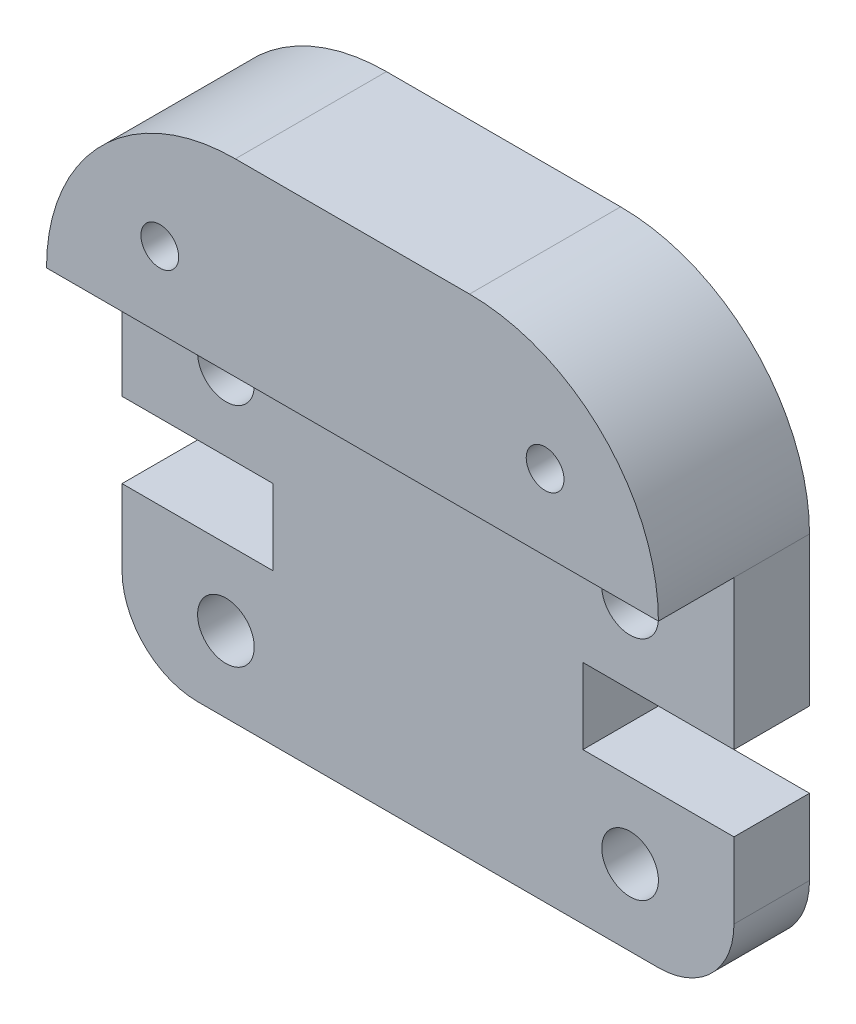
ISO-10303-21;
HEADER;
FILE_DESCRIPTION(('STEP AP214'),'2;1');
FILE_NAME('part.step','',(''),(''),'','','');
FILE_SCHEMA(('AUTOMOTIVE_DESIGN { 1 0 10303 214 1 1 1 1 }'));
ENDSEC;
DATA;
#1=APPLICATION_CONTEXT('core data for automotive mechanical design processes');
#2=APPLICATION_PROTOCOL_DEFINITION('international standard','automotive_design',2000,#1);
#3=PRODUCT_CONTEXT('',#1,'mechanical');
#4=PRODUCT('Part','Part','',(#3));
#5=PRODUCT_RELATED_PRODUCT_CATEGORY('part','',(#4));
#6=PRODUCT_DEFINITION_FORMATION('','',#4);
#7=PRODUCT_DEFINITION_CONTEXT('part definition',#1,'design');
#8=PRODUCT_DEFINITION('design','',#6,#7);
#9=PRODUCT_DEFINITION_SHAPE('','',#8);
#10=(LENGTH_UNIT() NAMED_UNIT(*) SI_UNIT(.MILLI.,.METRE.));
#11=(NAMED_UNIT(*) PLANE_ANGLE_UNIT() SI_UNIT($,.RADIAN.));
#12=(NAMED_UNIT(*) SI_UNIT($,.STERADIAN.) SOLID_ANGLE_UNIT());
#13=UNCERTAINTY_MEASURE_WITH_UNIT(LENGTH_MEASURE(1.E-05),#10,'distance_accuracy_value','');
#14=(GEOMETRIC_REPRESENTATION_CONTEXT(3) GLOBAL_UNCERTAINTY_ASSIGNED_CONTEXT((#13)) GLOBAL_UNIT_ASSIGNED_CONTEXT((#10,
#11,#12)) REPRESENTATION_CONTEXT('',''));
#15=CARTESIAN_POINT('',(0.,0.,0.));
#16=DIRECTION('',(0.,0.,1.));
#17=DIRECTION('',(1.,0.,0.));
#18=AXIS2_PLACEMENT_3D('',#15,#16,#17);
#19=CARTESIAN_POINT('',(14.2,2.,4.));
#20=DIRECTION('',(0.,0.,-1.));
#21=DIRECTION('',(-1.,0.,0.));
#22=AXIS2_PLACEMENT_3D('',#19,#20,#21);
#23=PLANE('',#22);
#24=CARTESIAN_POINT('',(3.00000000000321,11.942,4.));
#25=DIRECTION('',(0.,0.,1.));
#26=DIRECTION('',(1.,0.,0.));
#27=AXIS2_PLACEMENT_3D('',#24,#25,#26);
#28=CIRCLE('',#27,0.499999999999944);
#29=CARTESIAN_POINT('',(3.50000000000316,11.942,4.));
#30=VERTEX_POINT('',#29);
#31=EDGE_CURVE('E327',#30,#30,#28,.T.);
#32=ORIENTED_EDGE('',*,*,#31,.F.);
#33=EDGE_LOOP('',(#32));
#34=FACE_BOUND('',#33,.T.);
#35=CARTESIAN_POINT('',(13.1999999999968,11.942,4.));
#36=DIRECTION('',(0.,0.,1.));
#37=DIRECTION('',(-1.,0.,0.));
#38=AXIS2_PLACEMENT_3D('',#35,#36,#37);
#39=CIRCLE('',#38,0.499999999999945);
#40=CARTESIAN_POINT('',(12.6999999999968,11.942,4.));
#41=VERTEX_POINT('',#40);
#42=EDGE_CURVE('E333',#41,#41,#39,.T.);
#43=ORIENTED_EDGE('',*,*,#42,.F.);
#44=EDGE_LOOP('',(#43));
#45=FACE_BOUND('',#44,.T.);
#46=DIRECTION('',(1.,0.,0.));
#47=VECTOR('',#46,1.);
#48=CARTESIAN_POINT('',(16.2,9.945,4.));
#49=LINE('',#48,#47);
#50=CARTESIAN_POINT('',(0.,9.94499999999999,4.));
#51=VERTEX_POINT('',#50);
#52=CARTESIAN_POINT('',(16.2,9.945,4.));
#53=VERTEX_POINT('',#52);
#54=EDGE_CURVE('E279',#51,#53,#49,.T.);
#55=ORIENTED_EDGE('',*,*,#54,.T.);
#56=CARTESIAN_POINT('',(11.2,9.94499999999999,4.));
#57=DIRECTION('',(0.,0.,1.));
#58=DIRECTION('',(-1.,0.,0.));
#59=AXIS2_PLACEMENT_3D('',#56,#57,#58);
#60=CIRCLE('',#59,5.);
#61=CARTESIAN_POINT('',(11.2,14.945,4.));
#62=VERTEX_POINT('',#61);
#63=EDGE_CURVE('E133',#53,#62,#60,.T.);
#64=ORIENTED_EDGE('',*,*,#63,.T.);
#65=DIRECTION('',(-1.,0.,0.));
#66=VECTOR('',#65,1.);
#67=CARTESIAN_POINT('',(5.,14.945,4.));
#68=LINE('',#67,#66);
#69=CARTESIAN_POINT('',(5.,14.945,4.));
#70=VERTEX_POINT('',#69);
#71=EDGE_CURVE('E59',#62,#70,#68,.T.);
#72=ORIENTED_EDGE('',*,*,#71,.T.);
#73=CARTESIAN_POINT('',(5.,9.94499999999999,4.));
#74=DIRECTION('',(0.,0.,1.));
#75=DIRECTION('',(1.,0.,0.));
#76=AXIS2_PLACEMENT_3D('',#73,#74,#75);
#77=CIRCLE('',#76,5.);
#78=EDGE_CURVE('E124',#70,#51,#77,.T.);
#79=ORIENTED_EDGE('',*,*,#78,.T.);
#80=EDGE_LOOP('',(#55,#64,#72,#79));
#81=FACE_BOUND('',#80,.T.);
#82=ADVANCED_FACE('F34',(#34,#45,#81),#23,.F.);
#83=CARTESIAN_POINT('',(14.2,2.,4.));
#84=DIRECTION('',(0.,0.,-1.));
#85=DIRECTION('',(-1.,0.,0.));
#86=AXIS2_PLACEMENT_3D('',#83,#84,#85);
#87=CYLINDRICAL_SURFACE('',#86,2.);
#88=CARTESIAN_POINT('',(14.2,2.,2.));
#89=DIRECTION('',(0.,0.,1.));
#90=DIRECTION('',(1.,0.,0.));
#91=AXIS2_PLACEMENT_3D('',#88,#89,#90);
#92=CIRCLE('',#91,2.);
#93=CARTESIAN_POINT('',(14.2,0.,2.));
#94=VERTEX_POINT('',#93);
#95=CARTESIAN_POINT('',(16.2,2.,2.));
#96=VERTEX_POINT('',#95);
#97=EDGE_CURVE('E121',#94,#96,#92,.T.);
#98=ORIENTED_EDGE('',*,*,#97,.F.);
#99=DIRECTION('',(0.,0.,-1.));
#100=VECTOR('',#99,1.);
#101=CARTESIAN_POINT('',(14.2,0.,4.));
#102=LINE('',#101,#100);
#103=CARTESIAN_POINT('',(14.2,0.,0.));
#104=VERTEX_POINT('',#103);
#105=EDGE_CURVE('E114',#94,#104,#102,.T.);
#106=ORIENTED_EDGE('',*,*,#105,.T.);
#107=CARTESIAN_POINT('',(14.2,2.,0.));
#108=DIRECTION('',(0.,0.,1.));
#109=DIRECTION('',(-1.,0.,0.));
#110=AXIS2_PLACEMENT_3D('',#107,#108,#109);
#111=CIRCLE('',#110,2.);
#112=CARTESIAN_POINT('',(16.2,2.,0.));
#113=VERTEX_POINT('',#112);
#114=EDGE_CURVE('E118',#104,#113,#111,.T.);
#115=ORIENTED_EDGE('',*,*,#114,.T.);
#116=DIRECTION('',(0.,0.,-1.));
#117=VECTOR('',#116,1.);
#118=CARTESIAN_POINT('',(16.2,2.,4.));
#119=LINE('',#118,#117);
#120=EDGE_CURVE('E11',#96,#113,#119,.T.);
#121=ORIENTED_EDGE('',*,*,#120,.F.);
#122=EDGE_LOOP('',(#98,#106,#115,#121));
#123=FACE_BOUND('',#122,.T.);
#124=ADVANCED_FACE('F36',(#123),#87,.T.);
#125=CARTESIAN_POINT('',(16.2,2.,4.));
#126=DIRECTION('',(-1.,0.,0.));
#127=DIRECTION('',(0.,0.,1.));
#128=AXIS2_PLACEMENT_3D('',#125,#126,#127);
#129=PLANE('',#128);
#130=DIRECTION('',(0.,-1.,0.));
#131=VECTOR('',#130,1.);
#132=CARTESIAN_POINT('',(16.2,0.,2.));
#133=LINE('',#132,#131);
#134=CARTESIAN_POINT('',(16.2,4.,2.));
#135=VERTEX_POINT('',#134);
#136=EDGE_CURVE('E342',#135,#96,#133,.T.);
#137=ORIENTED_EDGE('',*,*,#136,.T.);
#138=ORIENTED_EDGE('',*,*,#120,.T.);
#139=DIRECTION('',(0.,1.,0.));
#140=VECTOR('',#139,1.);
#141=CARTESIAN_POINT('',(16.2,2.,0.));
#142=LINE('',#141,#140);
#143=CARTESIAN_POINT('',(16.2,4.,0.));
#144=VERTEX_POINT('',#143);
#145=EDGE_CURVE('E141',#113,#144,#142,.T.);
#146=ORIENTED_EDGE('',*,*,#145,.T.);
#147=DIRECTION('',(0.,0.,-1.));
#148=VECTOR('',#147,1.);
#149=CARTESIAN_POINT('',(16.2,4.,4.));
#150=LINE('',#149,#148);
#151=EDGE_CURVE('E43',#135,#144,#150,.T.);
#152=ORIENTED_EDGE('',*,*,#151,.F.);
#153=EDGE_LOOP('',(#137,#138,#146,#152));
#154=FACE_BOUND('',#153,.T.);
#155=ADVANCED_FACE('F228',(#154),#129,.F.);
#156=CARTESIAN_POINT('',(12.2,4.,4.));
#157=DIRECTION('',(0.,-1.,0.));
#158=DIRECTION('',(1.,0.,0.));
#159=AXIS2_PLACEMENT_3D('',#156,#157,#158);
#160=PLANE('',#159);
#161=DIRECTION('',(-1.,0.,0.));
#162=VECTOR('',#161,1.);
#163=CARTESIAN_POINT('',(12.2,4.,2.));
#164=LINE('',#163,#162);
#165=CARTESIAN_POINT('',(12.2,4.,2.));
#166=VERTEX_POINT('',#165);
#167=EDGE_CURVE('E225',#135,#166,#164,.T.);
#168=ORIENTED_EDGE('',*,*,#167,.F.);
#169=ORIENTED_EDGE('',*,*,#151,.T.);
#170=DIRECTION('',(-1.,0.,0.));
#171=VECTOR('',#170,1.);
#172=CARTESIAN_POINT('',(12.2,4.,0.));
#173=LINE('',#172,#171);
#174=CARTESIAN_POINT('',(12.2,4.,0.));
#175=VERTEX_POINT('',#174);
#176=EDGE_CURVE('E144',#144,#175,#173,.T.);
#177=ORIENTED_EDGE('',*,*,#176,.T.);
#178=DIRECTION('',(0.,0.,-1.));
#179=VECTOR('',#178,1.);
#180=CARTESIAN_POINT('',(12.2,4.,4.));
#181=LINE('',#180,#179);
#182=EDGE_CURVE('E215',#166,#175,#181,.T.);
#183=ORIENTED_EDGE('',*,*,#182,.F.);
#184=EDGE_LOOP('',(#168,#169,#177,#183));
#185=FACE_BOUND('',#184,.T.);
#186=ADVANCED_FACE('F220',(#185),#160,.F.);
#187=CARTESIAN_POINT('',(12.2,6.,4.));
#188=DIRECTION('',(-1.,0.,0.));
#189=DIRECTION('',(0.,0.,1.));
#190=AXIS2_PLACEMENT_3D('',#187,#188,#189);
#191=PLANE('',#190);
#192=DIRECTION('',(0.,1.,0.));
#193=VECTOR('',#192,1.);
#194=CARTESIAN_POINT('',(12.2,6.,2.));
#195=LINE('',#194,#193);
#196=CARTESIAN_POINT('',(12.2,6.,2.));
#197=VERTEX_POINT('',#196);
#198=EDGE_CURVE('E237',#166,#197,#195,.T.);
#199=ORIENTED_EDGE('',*,*,#198,.F.);
#200=ORIENTED_EDGE('',*,*,#182,.T.);
#201=DIRECTION('',(0.,1.,0.));
#202=VECTOR('',#201,1.);
#203=CARTESIAN_POINT('',(12.2,6.,0.));
#204=LINE('',#203,#202);
#205=CARTESIAN_POINT('',(12.2,6.,0.));
#206=VERTEX_POINT('',#205);
#207=EDGE_CURVE('E154',#175,#206,#204,.T.);
#208=ORIENTED_EDGE('',*,*,#207,.T.);
#209=DIRECTION('',(0.,0.,-1.));
#210=VECTOR('',#209,1.);
#211=CARTESIAN_POINT('',(12.2,6.,4.));
#212=LINE('',#211,#210);
#213=EDGE_CURVE('E213',#197,#206,#212,.T.);
#214=ORIENTED_EDGE('',*,*,#213,.F.);
#215=EDGE_LOOP('',(#199,#200,#208,#214));
#216=FACE_BOUND('',#215,.T.);
#217=ADVANCED_FACE('F234',(#216),#191,.F.);
#218=CARTESIAN_POINT('',(16.2,6.00000000000001,4.));
#219=DIRECTION('',(0.,1.,0.));
#220=DIRECTION('',(-1.,0.,0.));
#221=AXIS2_PLACEMENT_3D('',#218,#219,#220);
#222=PLANE('',#221);
#223=DIRECTION('',(1.,0.,0.));
#224=VECTOR('',#223,1.);
#225=CARTESIAN_POINT('',(16.2,6.00000000000001,2.));
#226=LINE('',#225,#224);
#227=CARTESIAN_POINT('',(16.2,6.00000000000001,2.));
#228=VERTEX_POINT('',#227);
#229=EDGE_CURVE('E309',#197,#228,#226,.T.);
#230=ORIENTED_EDGE('',*,*,#229,.F.);
#231=ORIENTED_EDGE('',*,*,#213,.T.);
#232=DIRECTION('',(1.,0.,0.));
#233=VECTOR('',#232,1.);
#234=CARTESIAN_POINT('',(16.2,6.00000000000001,0.));
#235=LINE('',#234,#233);
#236=CARTESIAN_POINT('',(16.2,6.00000000000001,0.));
#237=VERTEX_POINT('',#236);
#238=EDGE_CURVE('E157',#206,#237,#235,.T.);
#239=ORIENTED_EDGE('',*,*,#238,.T.);
#240=DIRECTION('',(0.,0.,-1.));
#241=VECTOR('',#240,1.);
#242=CARTESIAN_POINT('',(16.2,6.00000000000001,4.));
#243=LINE('',#242,#241);
#244=EDGE_CURVE('E211',#228,#237,#243,.T.);
#245=ORIENTED_EDGE('',*,*,#244,.F.);
#246=EDGE_LOOP('',(#230,#231,#239,#245));
#247=FACE_BOUND('',#246,.T.);
#248=ADVANCED_FACE('F354',(#247),#222,.F.);
#249=CARTESIAN_POINT('',(16.2,9.945,4.));
#250=DIRECTION('',(-1.,0.,0.));
#251=DIRECTION('',(0.,-1.,0.));
#252=AXIS2_PLACEMENT_3D('',#249,#250,#251);
#253=PLANE('',#252);
#254=CARTESIAN_POINT('',(16.2,9.945,2.));
#255=VERTEX_POINT('',#254);
#256=EDGE_CURVE('E288',#255,#228,#133,.T.);
#257=ORIENTED_EDGE('',*,*,#256,.T.);
#258=ORIENTED_EDGE('',*,*,#244,.T.);
#259=DIRECTION('',(0.,1.,0.));
#260=VECTOR('',#259,1.);
#261=CARTESIAN_POINT('',(16.2,9.945,0.));
#262=LINE('',#261,#260);
#263=CARTESIAN_POINT('',(16.2,9.945,0.));
#264=VERTEX_POINT('',#263);
#265=EDGE_CURVE('E160',#237,#264,#262,.T.);
#266=ORIENTED_EDGE('',*,*,#265,.T.);
#267=DIRECTION('',(0.,0.,-1.));
#268=VECTOR('',#267,1.);
#269=CARTESIAN_POINT('',(16.2,9.945,4.));
#270=LINE('',#269,#268);
#271=EDGE_CURVE('E207',#255,#264,#270,.T.);
#272=ORIENTED_EDGE('',*,*,#271,.F.);
#273=EDGE_LOOP('',(#257,#258,#266,#272));
#274=FACE_BOUND('',#273,.T.);
#275=ADVANCED_FACE('F350',(#274),#253,.F.);
#276=CARTESIAN_POINT('',(0.,9.94499999999999,4.));
#277=DIRECTION('',(1.,0.,0.));
#278=DIRECTION('',(0.,0.,-1.));
#279=AXIS2_PLACEMENT_3D('',#276,#277,#278);
#280=PLANE('',#279);
#281=DIRECTION('',(0.,1.,0.));
#282=VECTOR('',#281,1.);
#283=CARTESIAN_POINT('',(0.,9.94499999999999,2.));
#284=LINE('',#283,#282);
#285=CARTESIAN_POINT('',(0.,6.00000000000001,2.));
#286=VERTEX_POINT('',#285);
#287=CARTESIAN_POINT('',(0.,9.94499999999999,2.));
#288=VERTEX_POINT('',#287);
#289=EDGE_CURVE('E285',#286,#288,#284,.T.);
#290=ORIENTED_EDGE('',*,*,#289,.T.);
#291=DIRECTION('',(0.,0.,-1.));
#292=VECTOR('',#291,1.);
#293=CARTESIAN_POINT('',(0.,9.94499999999999,4.));
#294=LINE('',#293,#292);
#295=CARTESIAN_POINT('',(0.,9.94499999999999,0.));
#296=VERTEX_POINT('',#295);
#297=EDGE_CURVE('E197',#288,#296,#294,.T.);
#298=ORIENTED_EDGE('',*,*,#297,.T.);
#299=DIRECTION('',(0.,-1.,0.));
#300=VECTOR('',#299,1.);
#301=CARTESIAN_POINT('',(0.,9.94499999999999,0.));
#302=LINE('',#301,#300);
#303=CARTESIAN_POINT('',(0.,6.00000000000001,0.));
#304=VERTEX_POINT('',#303);
#305=EDGE_CURVE('E170',#296,#304,#302,.T.);
#306=ORIENTED_EDGE('',*,*,#305,.T.);
#307=DIRECTION('',(0.,0.,-1.));
#308=VECTOR('',#307,1.);
#309=CARTESIAN_POINT('',(0.,6.00000000000001,4.));
#310=LINE('',#309,#308);
#311=EDGE_CURVE('E195',#286,#304,#310,.T.);
#312=ORIENTED_EDGE('',*,*,#311,.F.);
#313=EDGE_LOOP('',(#290,#298,#306,#312));
#314=FACE_BOUND('',#313,.T.);
#315=ADVANCED_FACE('F294',(#314),#280,.F.);
#316=CARTESIAN_POINT('',(0.,6.00000000000001,4.));
#317=DIRECTION('',(0.,1.,0.));
#318=DIRECTION('',(0.,0.,1.));
#319=AXIS2_PLACEMENT_3D('',#316,#317,#318);
#320=PLANE('',#319);
#321=DIRECTION('',(1.,0.,0.));
#322=VECTOR('',#321,1.);
#323=CARTESIAN_POINT('',(0.,6.00000000000001,2.));
#324=LINE('',#323,#322);
#325=CARTESIAN_POINT('',(4.,6.00000000000001,2.));
#326=VERTEX_POINT('',#325);
#327=EDGE_CURVE('E307',#286,#326,#324,.T.);
#328=ORIENTED_EDGE('',*,*,#327,.F.);
#329=ORIENTED_EDGE('',*,*,#311,.T.);
#330=DIRECTION('',(1.,0.,0.));
#331=VECTOR('',#330,1.);
#332=CARTESIAN_POINT('',(0.,6.00000000000001,0.));
#333=LINE('',#332,#331);
#334=CARTESIAN_POINT('',(4.,6.00000000000001,0.));
#335=VERTEX_POINT('',#334);
#336=EDGE_CURVE('E173',#304,#335,#333,.T.);
#337=ORIENTED_EDGE('',*,*,#336,.T.);
#338=DIRECTION('',(0.,0.,-1.));
#339=VECTOR('',#338,1.);
#340=CARTESIAN_POINT('',(4.,6.00000000000001,4.));
#341=LINE('',#340,#339);
#342=EDGE_CURVE('E193',#326,#335,#341,.T.);
#343=ORIENTED_EDGE('',*,*,#342,.F.);
#344=EDGE_LOOP('',(#328,#329,#337,#343));
#345=FACE_BOUND('',#344,.T.);
#346=ADVANCED_FACE('F306',(#345),#320,.F.);
#347=CARTESIAN_POINT('',(4.,6.00000000000001,4.));
#348=DIRECTION('',(1.,0.,0.));
#349=DIRECTION('',(0.,0.,-1.));
#350=AXIS2_PLACEMENT_3D('',#347,#348,#349);
#351=PLANE('',#350);
#352=DIRECTION('',(0.,-1.,0.));
#353=VECTOR('',#352,1.);
#354=CARTESIAN_POINT('',(4.,6.00000000000001,2.));
#355=LINE('',#354,#353);
#356=CARTESIAN_POINT('',(4.,4.,2.));
#357=VERTEX_POINT('',#356);
#358=EDGE_CURVE('E310',#326,#357,#355,.T.);
#359=ORIENTED_EDGE('',*,*,#358,.F.);
#360=ORIENTED_EDGE('',*,*,#342,.T.);
#361=DIRECTION('',(0.,-1.,0.));
#362=VECTOR('',#361,1.);
#363=CARTESIAN_POINT('',(4.,6.00000000000001,0.));
#364=LINE('',#363,#362);
#365=CARTESIAN_POINT('',(4.,4.,0.));
#366=VERTEX_POINT('',#365);
#367=EDGE_CURVE('E176',#335,#366,#364,.T.);
#368=ORIENTED_EDGE('',*,*,#367,.T.);
#369=DIRECTION('',(0.,0.,-1.));
#370=VECTOR('',#369,1.);
#371=CARTESIAN_POINT('',(4.,4.,4.));
#372=LINE('',#371,#370);
#373=EDGE_CURVE('E191',#357,#366,#372,.T.);
#374=ORIENTED_EDGE('',*,*,#373,.F.);
#375=EDGE_LOOP('',(#359,#360,#368,#374));
#376=FACE_BOUND('',#375,.T.);
#377=ADVANCED_FACE('F392',(#376),#351,.F.);
#378=CARTESIAN_POINT('',(4.,4.,4.));
#379=DIRECTION('',(0.,-1.,0.));
#380=DIRECTION('',(0.,0.,-1.));
#381=AXIS2_PLACEMENT_3D('',#378,#379,#380);
#382=PLANE('',#381);
#383=DIRECTION('',(-1.,0.,0.));
#384=VECTOR('',#383,1.);
#385=CARTESIAN_POINT('',(4.,4.,2.));
#386=LINE('',#385,#384);
#387=CARTESIAN_POINT('',(0.,4.,2.));
#388=VERTEX_POINT('',#387);
#389=EDGE_CURVE('E313',#357,#388,#386,.T.);
#390=ORIENTED_EDGE('',*,*,#389,.F.);
#391=ORIENTED_EDGE('',*,*,#373,.T.);
#392=DIRECTION('',(-1.,0.,0.));
#393=VECTOR('',#392,1.);
#394=CARTESIAN_POINT('',(4.,4.,0.));
#395=LINE('',#394,#393);
#396=CARTESIAN_POINT('',(0.,4.,0.));
#397=VERTEX_POINT('',#396);
#398=EDGE_CURVE('E179',#366,#397,#395,.T.);
#399=ORIENTED_EDGE('',*,*,#398,.T.);
#400=DIRECTION('',(0.,0.,-1.));
#401=VECTOR('',#400,1.);
#402=CARTESIAN_POINT('',(0.,4.,4.));
#403=LINE('',#402,#401);
#404=EDGE_CURVE('E189',#388,#397,#403,.T.);
#405=ORIENTED_EDGE('',*,*,#404,.F.);
#406=EDGE_LOOP('',(#390,#391,#399,#405));
#407=FACE_BOUND('',#406,.T.);
#408=ADVANCED_FACE('F388',(#407),#382,.F.);
#409=CARTESIAN_POINT('',(0.,2.,4.));
#410=DIRECTION('',(1.,0.,0.));
#411=DIRECTION('',(0.,0.,-1.));
#412=AXIS2_PLACEMENT_3D('',#409,#410,#411);
#413=PLANE('',#412);
#414=CARTESIAN_POINT('',(0.,2.,2.));
#415=VERTEX_POINT('',#414);
#416=EDGE_CURVE('E290',#415,#388,#284,.T.);
#417=ORIENTED_EDGE('',*,*,#416,.T.);
#418=ORIENTED_EDGE('',*,*,#404,.T.);
#419=DIRECTION('',(0.,-1.,0.));
#420=VECTOR('',#419,1.);
#421=CARTESIAN_POINT('',(0.,2.,0.));
#422=LINE('',#421,#420);
#423=CARTESIAN_POINT('',(0.,2.,0.));
#424=VERTEX_POINT('',#423);
#425=EDGE_CURVE('E182',#397,#424,#422,.T.);
#426=ORIENTED_EDGE('',*,*,#425,.T.);
#427=DIRECTION('',(0.,0.,-1.));
#428=VECTOR('',#427,1.);
#429=CARTESIAN_POINT('',(0.,2.,4.));
#430=LINE('',#429,#428);
#431=EDGE_CURVE('E187',#415,#424,#430,.T.);
#432=ORIENTED_EDGE('',*,*,#431,.F.);
#433=EDGE_LOOP('',(#417,#418,#426,#432));
#434=FACE_BOUND('',#433,.T.);
#435=ADVANCED_FACE('F384',(#434),#413,.F.);
#436=CARTESIAN_POINT('',(2.,2.,4.));
#437=DIRECTION('',(0.,0.,-1.));
#438=DIRECTION('',(-1.,0.,0.));
#439=AXIS2_PLACEMENT_3D('',#436,#437,#438);
#440=CYLINDRICAL_SURFACE('',#439,2.);
#441=CARTESIAN_POINT('',(2.,2.,2.));
#442=DIRECTION('',(0.,0.,1.));
#443=DIRECTION('',(1.,0.,0.));
#444=AXIS2_PLACEMENT_3D('',#441,#442,#443);
#445=CIRCLE('',#444,2.);
#446=CARTESIAN_POINT('',(2.,0.,2.));
#447=VERTEX_POINT('',#446);
#448=EDGE_CURVE('E50',#415,#447,#445,.T.);
#449=ORIENTED_EDGE('',*,*,#448,.F.);
#450=ORIENTED_EDGE('',*,*,#431,.T.);
#451=CARTESIAN_POINT('',(2.,2.,0.));
#452=DIRECTION('',(0.,0.,1.));
#453=DIRECTION('',(1.,0.,0.));
#454=AXIS2_PLACEMENT_3D('',#451,#452,#453);
#455=CIRCLE('',#454,2.);
#456=CARTESIAN_POINT('',(2.,0.,0.));
#457=VERTEX_POINT('',#456);
#458=EDGE_CURVE('E134',#424,#457,#455,.T.);
#459=ORIENTED_EDGE('',*,*,#458,.T.);
#460=DIRECTION('',(0.,0.,-1.));
#461=VECTOR('',#460,1.);
#462=CARTESIAN_POINT('',(2.,0.,4.));
#463=LINE('',#462,#461);
#464=EDGE_CURVE('E123',#447,#457,#463,.T.);
#465=ORIENTED_EDGE('',*,*,#464,.F.);
#466=EDGE_LOOP('',(#449,#450,#459,#465));
#467=FACE_BOUND('',#466,.T.);
#468=ADVANCED_FACE('F381',(#467),#440,.T.);
#469=CARTESIAN_POINT('',(2.,0.,4.));
#470=DIRECTION('',(0.,1.,0.));
#471=DIRECTION('',(-1.,0.,0.));
#472=AXIS2_PLACEMENT_3D('',#469,#470,#471);
#473=PLANE('',#472);
#474=DIRECTION('',(-1.,0.,0.));
#475=VECTOR('',#474,1.);
#476=CARTESIAN_POINT('',(0.,0.,2.));
#477=LINE('',#476,#475);
#478=EDGE_CURVE('E295',#94,#447,#477,.T.);
#479=ORIENTED_EDGE('',*,*,#478,.T.);
#480=ORIENTED_EDGE('',*,*,#464,.T.);
#481=DIRECTION('',(1.,0.,0.));
#482=VECTOR('',#481,1.);
#483=CARTESIAN_POINT('',(2.,0.,0.));
#484=LINE('',#483,#482);
#485=EDGE_CURVE('E127',#457,#104,#484,.T.);
#486=ORIENTED_EDGE('',*,*,#485,.T.);
#487=ORIENTED_EDGE('',*,*,#105,.F.);
#488=EDGE_LOOP('',(#479,#480,#486,#487));
#489=FACE_BOUND('',#488,.T.);
#490=ADVANCED_FACE('F128',(#489),#473,.F.);
#491=CARTESIAN_POINT('',(13.4499999999969,8.,4.));
#492=DIRECTION('',(0.,0.,-1.));
#493=DIRECTION('',(-1.,0.,0.));
#494=AXIS2_PLACEMENT_3D('',#491,#492,#493);
#495=CYLINDRICAL_SURFACE('',#494,0.750000000003057);
#496=CARTESIAN_POINT('',(13.4499999999969,8.,0.));
#497=DIRECTION('',(0.,0.,1.));
#498=DIRECTION('',(1.,0.,0.));
#499=AXIS2_PLACEMENT_3D('',#496,#497,#498);
#500=CIRCLE('',#499,0.750000000003057);
#501=CARTESIAN_POINT('',(14.2,8.,0.));
#502=VERTEX_POINT('',#501);
#503=EDGE_CURVE('E142',#502,#502,#500,.T.);
#504=ORIENTED_EDGE('',*,*,#503,.F.);
#505=EDGE_LOOP('',(#504));
#506=FACE_BOUND('',#505,.T.);
#507=CARTESIAN_POINT('',(13.4499999999969,8.,2.));
#508=DIRECTION('',(0.,0.,1.));
#509=DIRECTION('',(1.,0.,0.));
#510=AXIS2_PLACEMENT_3D('',#507,#508,#509);
#511=CIRCLE('',#510,0.750000000003057);
#512=CARTESIAN_POINT('',(14.2,8.,2.));
#513=VERTEX_POINT('',#512);
#514=EDGE_CURVE('E594',#513,#513,#511,.T.);
#515=ORIENTED_EDGE('',*,*,#514,.T.);
#516=EDGE_LOOP('',(#515));
#517=FACE_BOUND('',#516,.T.);
#518=ADVANCED_FACE('F373',(#506,#517),#495,.F.);
#519=CARTESIAN_POINT('',(13.4499999999969,2.,4.));
#520=DIRECTION('',(0.,0.,-1.));
#521=DIRECTION('',(-1.,0.,0.));
#522=AXIS2_PLACEMENT_3D('',#519,#520,#521);
#523=CYLINDRICAL_SURFACE('',#522,0.750000000003057);
#524=CARTESIAN_POINT('',(13.4499999999969,2.,0.));
#525=DIRECTION('',(0.,0.,1.));
#526=DIRECTION('',(-1.,0.,0.));
#527=AXIS2_PLACEMENT_3D('',#524,#525,#526);
#528=CIRCLE('',#527,0.750000000003057);
#529=CARTESIAN_POINT('',(12.6999999999939,2.,0.));
#530=VERTEX_POINT('',#529);
#531=EDGE_CURVE('E147',#530,#530,#528,.T.);
#532=ORIENTED_EDGE('',*,*,#531,.F.);
#533=EDGE_LOOP('',(#532));
#534=FACE_BOUND('',#533,.T.);
#535=CARTESIAN_POINT('',(13.4499999999969,2.,2.));
#536=DIRECTION('',(0.,0.,1.));
#537=DIRECTION('',(1.,0.,0.));
#538=AXIS2_PLACEMENT_3D('',#535,#536,#537);
#539=CIRCLE('',#538,0.750000000003057);
#540=CARTESIAN_POINT('',(14.2,2.,2.));
#541=VERTEX_POINT('',#540);
#542=EDGE_CURVE('E589',#541,#541,#539,.T.);
#543=ORIENTED_EDGE('',*,*,#542,.T.);
#544=EDGE_LOOP('',(#543));
#545=FACE_BOUND('',#544,.T.);
#546=ADVANCED_FACE('F532',(#534,#545),#523,.F.);
#547=CARTESIAN_POINT('',(2.75000000000306,2.,4.));
#548=DIRECTION('',(0.,0.,-1.));
#549=DIRECTION('',(-1.,0.,0.));
#550=AXIS2_PLACEMENT_3D('',#547,#548,#549);
#551=CYLINDRICAL_SURFACE('',#550,0.750000000000133);
#552=CARTESIAN_POINT('',(2.75000000000306,2.,0.));
#553=DIRECTION('',(0.,0.,1.));
#554=DIRECTION('',(1.,0.,0.));
#555=AXIS2_PLACEMENT_3D('',#552,#553,#554);
#556=CIRCLE('',#555,0.750000000000133);
#557=CARTESIAN_POINT('',(3.50000000000319,2.,0.));
#558=VERTEX_POINT('',#557);
#559=EDGE_CURVE('E323',#558,#558,#556,.T.);
#560=ORIENTED_EDGE('',*,*,#559,.F.);
#561=EDGE_LOOP('',(#560));
#562=FACE_BOUND('',#561,.T.);
#563=CARTESIAN_POINT('',(2.75000000000306,2.,2.));
#564=DIRECTION('',(0.,0.,1.));
#565=DIRECTION('',(1.,0.,0.));
#566=AXIS2_PLACEMENT_3D('',#563,#564,#565);
#567=CIRCLE('',#566,0.750000000000133);
#568=CARTESIAN_POINT('',(3.50000000000319,2.,2.));
#569=VERTEX_POINT('',#568);
#570=EDGE_CURVE('E587',#569,#569,#567,.T.);
#571=ORIENTED_EDGE('',*,*,#570,.T.);
#572=EDGE_LOOP('',(#571));
#573=FACE_BOUND('',#572,.T.);
#574=ADVANCED_FACE('F540',(#562,#573),#551,.F.);
#575=CARTESIAN_POINT('',(2.75000000000306,8.,4.));
#576=DIRECTION('',(0.,0.,-1.));
#577=DIRECTION('',(-1.,0.,0.));
#578=AXIS2_PLACEMENT_3D('',#575,#576,#577);
#579=CYLINDRICAL_SURFACE('',#578,0.750000000003058);
#580=CARTESIAN_POINT('',(2.75000000000306,8.,0.));
#581=DIRECTION('',(0.,0.,1.));
#582=DIRECTION('',(-1.,0.,0.));
#583=AXIS2_PLACEMENT_3D('',#580,#581,#582);
#584=CIRCLE('',#583,0.750000000003058);
#585=CARTESIAN_POINT('',(2.,8.,0.));
#586=VERTEX_POINT('',#585);
#587=EDGE_CURVE('E320',#586,#586,#584,.T.);
#588=ORIENTED_EDGE('',*,*,#587,.F.);
#589=EDGE_LOOP('',(#588));
#590=FACE_BOUND('',#589,.T.);
#591=CARTESIAN_POINT('',(2.75000000000306,8.,2.));
#592=DIRECTION('',(0.,0.,1.));
#593=DIRECTION('',(1.,0.,0.));
#594=AXIS2_PLACEMENT_3D('',#591,#592,#593);
#595=CIRCLE('',#594,0.750000000003058);
#596=CARTESIAN_POINT('',(3.50000000000612,8.,2.));
#597=VERTEX_POINT('',#596);
#598=EDGE_CURVE('E38',#597,#597,#595,.T.);
#599=ORIENTED_EDGE('',*,*,#598,.T.);
#600=EDGE_LOOP('',(#599));
#601=FACE_BOUND('',#600,.T.);
#602=ADVANCED_FACE('F377',(#590,#601),#579,.F.);
#603=CARTESIAN_POINT('',(14.2,2.,0.));
#604=DIRECTION('',(0.,0.,-1.));
#605=DIRECTION('',(-1.,0.,0.));
#606=AXIS2_PLACEMENT_3D('',#603,#604,#605);
#607=PLANE('',#606);
#608=ORIENTED_EDGE('',*,*,#559,.T.);
#609=EDGE_LOOP('',(#608));
#610=FACE_BOUND('',#609,.T.);
#611=CARTESIAN_POINT('',(13.1999999999968,11.942,0.));
#612=DIRECTION('',(0.,0.,1.));
#613=DIRECTION('',(-1.,0.,0.));
#614=AXIS2_PLACEMENT_3D('',#611,#612,#613);
#615=CIRCLE('',#614,0.499999999999945);
#616=CARTESIAN_POINT('',(12.6999999999968,11.942,0.));
#617=VERTEX_POINT('',#616);
#618=EDGE_CURVE('E330',#617,#617,#615,.T.);
#619=ORIENTED_EDGE('',*,*,#618,.T.);
#620=EDGE_LOOP('',(#619));
#621=FACE_BOUND('',#620,.T.);
#622=ORIENTED_EDGE('',*,*,#503,.T.);
#623=EDGE_LOOP('',(#622));
#624=FACE_BOUND('',#623,.T.);
#625=ORIENTED_EDGE('',*,*,#114,.F.);
#626=ORIENTED_EDGE('',*,*,#485,.F.);
#627=ORIENTED_EDGE('',*,*,#458,.F.);
#628=ORIENTED_EDGE('',*,*,#425,.F.);
#629=ORIENTED_EDGE('',*,*,#398,.F.);
#630=ORIENTED_EDGE('',*,*,#367,.F.);
#631=ORIENTED_EDGE('',*,*,#336,.F.);
#632=ORIENTED_EDGE('',*,*,#305,.F.);
#633=CARTESIAN_POINT('',(5.,9.94499999999999,0.));
#634=DIRECTION('',(0.,0.,1.));
#635=DIRECTION('',(1.,0.,0.));
#636=AXIS2_PLACEMENT_3D('',#633,#634,#635);
#637=CIRCLE('',#636,5.);
#638=CARTESIAN_POINT('',(5.,14.945,0.));
#639=VERTEX_POINT('',#638);
#640=EDGE_CURVE('E167',#639,#296,#637,.T.);
#641=ORIENTED_EDGE('',*,*,#640,.F.);
#642=DIRECTION('',(-1.,0.,0.));
#643=VECTOR('',#642,1.);
#644=CARTESIAN_POINT('',(5.,14.945,0.));
#645=LINE('',#644,#643);
#646=CARTESIAN_POINT('',(11.2,14.945,0.));
#647=VERTEX_POINT('',#646);
#648=EDGE_CURVE('E165',#647,#639,#645,.T.);
#649=ORIENTED_EDGE('',*,*,#648,.F.);
#650=CARTESIAN_POINT('',(11.2,9.94499999999999,0.));
#651=DIRECTION('',(0.,0.,1.));
#652=DIRECTION('',(-1.,0.,0.));
#653=AXIS2_PLACEMENT_3D('',#650,#651,#652);
#654=CIRCLE('',#653,5.);
#655=EDGE_CURVE('E163',#264,#647,#654,.T.);
#656=ORIENTED_EDGE('',*,*,#655,.F.);
#657=ORIENTED_EDGE('',*,*,#265,.F.);
#658=ORIENTED_EDGE('',*,*,#238,.F.);
#659=ORIENTED_EDGE('',*,*,#207,.F.);
#660=ORIENTED_EDGE('',*,*,#176,.F.);
#661=ORIENTED_EDGE('',*,*,#145,.F.);
#662=EDGE_LOOP('',(#625,#626,#627,#628,#629,#630,#631,#632,#641,#649,#656,#657,#658,#659,#660,#661));
#663=FACE_BOUND('',#662,.T.);
#664=ORIENTED_EDGE('',*,*,#531,.T.);
#665=EDGE_LOOP('',(#664));
#666=FACE_BOUND('',#665,.T.);
#667=CARTESIAN_POINT('',(3.00000000000321,11.942,0.));
#668=DIRECTION('',(0.,0.,1.));
#669=DIRECTION('',(1.,0.,0.));
#670=AXIS2_PLACEMENT_3D('',#667,#668,#669);
#671=CIRCLE('',#670,0.499999999999944);
#672=CARTESIAN_POINT('',(3.50000000000316,11.942,0.));
#673=VERTEX_POINT('',#672);
#674=EDGE_CURVE('E326',#673,#673,#671,.T.);
#675=ORIENTED_EDGE('',*,*,#674,.T.);
#676=EDGE_LOOP('',(#675));
#677=FACE_BOUND('',#676,.T.);
#678=ORIENTED_EDGE('',*,*,#587,.T.);
#679=EDGE_LOOP('',(#678));
#680=FACE_BOUND('',#679,.T.);
#681=ADVANCED_FACE('F137',(#610,#621,#624,#663,#666,#677,#680),#607,.T.);
#682=CARTESIAN_POINT('',(11.2,9.94499999999999,4.));
#683=DIRECTION('',(0.,0.,-1.));
#684=DIRECTION('',(-1.,0.,0.));
#685=AXIS2_PLACEMENT_3D('',#682,#683,#684);
#686=CYLINDRICAL_SURFACE('',#685,5.);
#687=ORIENTED_EDGE('',*,*,#655,.T.);
#688=DIRECTION('',(0.,0.,-1.));
#689=VECTOR('',#688,1.);
#690=CARTESIAN_POINT('',(11.2,14.945,4.));
#691=LINE('',#690,#689);
#692=EDGE_CURVE('E204',#62,#647,#691,.T.);
#693=ORIENTED_EDGE('',*,*,#692,.F.);
#694=ORIENTED_EDGE('',*,*,#63,.F.);
#695=EDGE_CURVE('E208',#53,#255,#270,.T.);
#696=ORIENTED_EDGE('',*,*,#695,.T.);
#697=ORIENTED_EDGE('',*,*,#271,.T.);
#698=EDGE_LOOP('',(#687,#693,#694,#696,#697));
#699=FACE_BOUND('',#698,.T.);
#700=ADVANCED_FACE('F345',(#699),#686,.T.);
#701=CARTESIAN_POINT('',(5.,14.945,4.));
#702=DIRECTION('',(0.,-1.,0.));
#703=DIRECTION('',(0.,0.,-1.));
#704=AXIS2_PLACEMENT_3D('',#701,#702,#703);
#705=PLANE('',#704);
#706=ORIENTED_EDGE('',*,*,#648,.T.);
#707=DIRECTION('',(0.,0.,-1.));
#708=VECTOR('',#707,1.);
#709=CARTESIAN_POINT('',(5.,14.945,4.));
#710=LINE('',#709,#708);
#711=EDGE_CURVE('E201',#70,#639,#710,.T.);
#712=ORIENTED_EDGE('',*,*,#711,.F.);
#713=ORIENTED_EDGE('',*,*,#71,.F.);
#714=ORIENTED_EDGE('',*,*,#692,.T.);
#715=EDGE_LOOP('',(#706,#712,#713,#714));
#716=FACE_BOUND('',#715,.T.);
#717=ADVANCED_FACE('F348',(#716),#705,.F.);
#718=CARTESIAN_POINT('',(5.,9.94499999999999,4.));
#719=DIRECTION('',(0.,0.,-1.));
#720=DIRECTION('',(-1.,0.,0.));
#721=AXIS2_PLACEMENT_3D('',#718,#719,#720);
#722=CYLINDRICAL_SURFACE('',#721,5.);
#723=ORIENTED_EDGE('',*,*,#640,.T.);
#724=ORIENTED_EDGE('',*,*,#297,.F.);
#725=EDGE_CURVE('E198',#51,#288,#294,.T.);
#726=ORIENTED_EDGE('',*,*,#725,.F.);
#727=ORIENTED_EDGE('',*,*,#78,.F.);
#728=ORIENTED_EDGE('',*,*,#711,.T.);
#729=EDGE_LOOP('',(#723,#724,#726,#727,#728));
#730=FACE_BOUND('',#729,.T.);
#731=ADVANCED_FACE('F297',(#730),#722,.T.);
#732=CARTESIAN_POINT('',(13.1999999999968,11.942,4.));
#733=DIRECTION('',(0.,0.,-1.));
#734=DIRECTION('',(-1.,0.,0.));
#735=AXIS2_PLACEMENT_3D('',#732,#733,#734);
#736=CYLINDRICAL_SURFACE('',#735,0.499999999999945);
#737=ORIENTED_EDGE('',*,*,#42,.T.);
#738=EDGE_LOOP('',(#737));
#739=FACE_BOUND('',#738,.T.);
#740=ORIENTED_EDGE('',*,*,#618,.F.);
#741=EDGE_LOOP('',(#740));
#742=FACE_BOUND('',#741,.T.);
#743=ADVANCED_FACE('F403',(#739,#742),#736,.F.);
#744=CARTESIAN_POINT('',(3.00000000000321,11.942,4.));
#745=DIRECTION('',(0.,0.,-1.));
#746=DIRECTION('',(-1.,0.,0.));
#747=AXIS2_PLACEMENT_3D('',#744,#745,#746);
#748=CYLINDRICAL_SURFACE('',#747,0.499999999999944);
#749=ORIENTED_EDGE('',*,*,#31,.T.);
#750=EDGE_LOOP('',(#749));
#751=FACE_BOUND('',#750,.T.);
#752=ORIENTED_EDGE('',*,*,#674,.F.);
#753=EDGE_LOOP('',(#752));
#754=FACE_BOUND('',#753,.T.);
#755=ADVANCED_FACE('F428',(#751,#754),#748,.F.);
#756=CARTESIAN_POINT('',(0.,0.,2.));
#757=DIRECTION('',(0.,0.,1.));
#758=DIRECTION('',(1.,0.,0.));
#759=AXIS2_PLACEMENT_3D('',#756,#757,#758);
#760=PLANE('',#759);
#761=ORIENTED_EDGE('',*,*,#514,.F.);
#762=EDGE_LOOP('',(#761));
#763=FACE_BOUND('',#762,.T.);
#764=ORIENTED_EDGE('',*,*,#542,.F.);
#765=EDGE_LOOP('',(#764));
#766=FACE_BOUND('',#765,.T.);
#767=ORIENTED_EDGE('',*,*,#570,.F.);
#768=EDGE_LOOP('',(#767));
#769=FACE_BOUND('',#768,.T.);
#770=ORIENTED_EDGE('',*,*,#598,.F.);
#771=EDGE_LOOP('',(#770));
#772=FACE_BOUND('',#771,.T.);
#773=ORIENTED_EDGE('',*,*,#97,.T.);
#774=ORIENTED_EDGE('',*,*,#136,.F.);
#775=ORIENTED_EDGE('',*,*,#167,.T.);
#776=ORIENTED_EDGE('',*,*,#198,.T.);
#777=ORIENTED_EDGE('',*,*,#229,.T.);
#778=ORIENTED_EDGE('',*,*,#256,.F.);
#779=DIRECTION('',(1.,0.,0.));
#780=VECTOR('',#779,1.);
#781=CARTESIAN_POINT('',(16.2,9.945,2.));
#782=LINE('',#781,#780);
#783=EDGE_CURVE('E276',#288,#255,#782,.T.);
#784=ORIENTED_EDGE('',*,*,#783,.F.);
#785=ORIENTED_EDGE('',*,*,#289,.F.);
#786=ORIENTED_EDGE('',*,*,#327,.T.);
#787=ORIENTED_EDGE('',*,*,#358,.T.);
#788=ORIENTED_EDGE('',*,*,#389,.T.);
#789=ORIENTED_EDGE('',*,*,#416,.F.);
#790=ORIENTED_EDGE('',*,*,#448,.T.);
#791=ORIENTED_EDGE('',*,*,#478,.F.);
#792=EDGE_LOOP('',(#773,#774,#775,#776,#777,#778,#784,#785,#786,#787,#788,#789,#790,#791));
#793=FACE_BOUND('',#792,.T.);
#794=ADVANCED_FACE('F284',(#763,#766,#769,#772,#793),#760,.T.);
#795=CARTESIAN_POINT('',(16.2,9.945,2.));
#796=DIRECTION('',(0.,-1.,0.));
#797=DIRECTION('',(1.,0.,0.));
#798=AXIS2_PLACEMENT_3D('',#795,#796,#797);
#799=PLANE('',#798);
#800=ORIENTED_EDGE('',*,*,#54,.F.);
#801=ORIENTED_EDGE('',*,*,#725,.T.);
#802=ORIENTED_EDGE('',*,*,#783,.T.);
#803=ORIENTED_EDGE('',*,*,#695,.F.);
#804=EDGE_LOOP('',(#800,#801,#802,#803));
#805=FACE_BOUND('',#804,.T.);
#806=ADVANCED_FACE('F275',(#805),#799,.T.);
#807=CLOSED_SHELL('',(#82,#124,#155,#186,#217,#248,#275,#315,#346,#377,#408,#435,#468,#490,#518,
#546,#574,#602,#681,#700,#717,#731,#743,#755,#794,#806));
#808=MANIFOLD_SOLID_BREP('B2',#807);
#809=ADVANCED_BREP_SHAPE_REPRESENTATION('',(#18,#808),#14);
#810=SHAPE_DEFINITION_REPRESENTATION(#9,#809);
ENDSEC;
END-ISO-10303-21;
